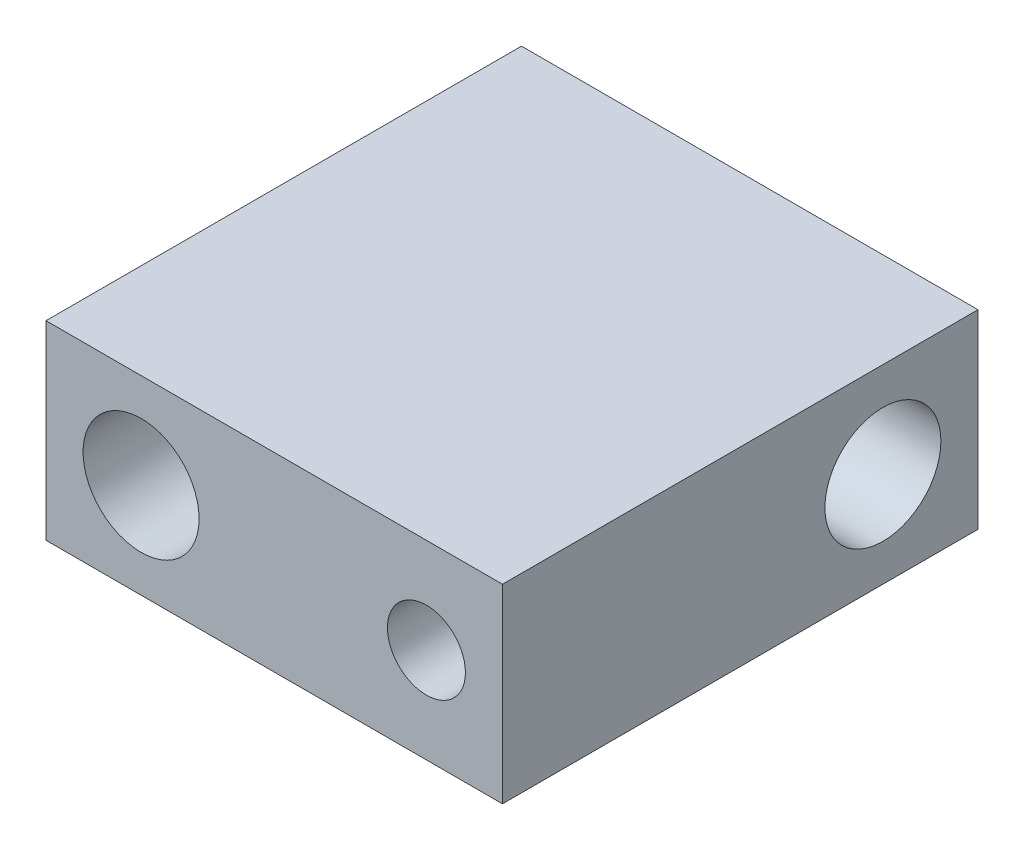
ISO-10303-21;
HEADER;
FILE_DESCRIPTION(('STEP AP214'),'2;1');
FILE_NAME('part.step','',(''),(''),'','','');
FILE_SCHEMA(('AUTOMOTIVE_DESIGN { 1 0 10303 214 1 1 1 1 }'));
ENDSEC;
DATA;
#1=APPLICATION_CONTEXT('core data for automotive mechanical design processes');
#2=APPLICATION_PROTOCOL_DEFINITION('international standard','automotive_design',2000,#1);
#3=PRODUCT_CONTEXT('',#1,'mechanical');
#4=PRODUCT('Part','Part','',(#3));
#5=PRODUCT_RELATED_PRODUCT_CATEGORY('part','',(#4));
#6=PRODUCT_DEFINITION_FORMATION('','',#4);
#7=PRODUCT_DEFINITION_CONTEXT('part definition',#1,'design');
#8=PRODUCT_DEFINITION('design','',#6,#7);
#9=PRODUCT_DEFINITION_SHAPE('','',#8);
#10=(LENGTH_UNIT() NAMED_UNIT(*) SI_UNIT(.MILLI.,.METRE.));
#11=(NAMED_UNIT(*) PLANE_ANGLE_UNIT() SI_UNIT($,.RADIAN.));
#12=(NAMED_UNIT(*) SI_UNIT($,.STERADIAN.) SOLID_ANGLE_UNIT());
#13=UNCERTAINTY_MEASURE_WITH_UNIT(LENGTH_MEASURE(1.E-05),#10,'distance_accuracy_value','');
#14=(GEOMETRIC_REPRESENTATION_CONTEXT(3) GLOBAL_UNCERTAINTY_ASSIGNED_CONTEXT((#13)) GLOBAL_UNIT_ASSIGNED_CONTEXT((#10,
#11,#12)) REPRESENTATION_CONTEXT('',''));
#15=CARTESIAN_POINT('',(0.,0.,0.));
#16=DIRECTION('',(0.,0.,1.));
#17=DIRECTION('',(1.,0.,0.));
#18=AXIS2_PLACEMENT_3D('',#15,#16,#17);
#19=CARTESIAN_POINT('',(0.,0.,30.));
#20=DIRECTION('',(0.,0.,1.));
#21=DIRECTION('',(1.,0.,0.));
#22=AXIS2_PLACEMENT_3D('',#19,#20,#21);
#23=PLANE('',#22);
#24=CARTESIAN_POINT('',(-14.,0.,30.));
#25=DIRECTION('',(0.,0.,1.));
#26=DIRECTION('',(1.,0.,0.));
#27=AXIS2_PLACEMENT_3D('',#24,#25,#26);
#28=CIRCLE('',#27,6.1);
#29=CARTESIAN_POINT('',(-7.9,0.,30.));
#30=VERTEX_POINT('',#29);
#31=EDGE_CURVE('E110',#30,#30,#28,.T.);
#32=ORIENTED_EDGE('',*,*,#31,.F.);
#33=EDGE_LOOP('',(#32));
#34=FACE_BOUND('',#33,.T.);
#35=DIRECTION('',(0.,1.,0.));
#36=VECTOR('',#35,1.);
#37=CARTESIAN_POINT('',(24.,10.,30.));
#38=LINE('',#37,#36);
#39=CARTESIAN_POINT('',(24.,-10.,30.));
#40=VERTEX_POINT('',#39);
#41=CARTESIAN_POINT('',(24.,10.,30.));
#42=VERTEX_POINT('',#41);
#43=EDGE_CURVE('E78',#40,#42,#38,.T.);
#44=ORIENTED_EDGE('',*,*,#43,.T.);
#45=DIRECTION('',(-1.,0.,0.));
#46=VECTOR('',#45,1.);
#47=CARTESIAN_POINT('',(-24.,10.,30.));
#48=LINE('',#47,#46);
#49=CARTESIAN_POINT('',(-24.,10.,30.));
#50=VERTEX_POINT('',#49);
#51=EDGE_CURVE('E116',#42,#50,#48,.T.);
#52=ORIENTED_EDGE('',*,*,#51,.T.);
#53=DIRECTION('',(0.,-1.,0.));
#54=VECTOR('',#53,1.);
#55=CARTESIAN_POINT('',(-24.,10.,30.));
#56=LINE('',#55,#54);
#57=CARTESIAN_POINT('',(-24.,-10.,30.));
#58=VERTEX_POINT('',#57);
#59=EDGE_CURVE('E53',#50,#58,#56,.T.);
#60=ORIENTED_EDGE('',*,*,#59,.T.);
#61=DIRECTION('',(1.,0.,0.));
#62=VECTOR('',#61,1.);
#63=CARTESIAN_POINT('',(-24.,-10.,30.));
#64=LINE('',#63,#62);
#65=EDGE_CURVE('E48',#58,#40,#64,.T.);
#66=ORIENTED_EDGE('',*,*,#65,.T.);
#67=EDGE_LOOP('',(#44,#52,#60,#66));
#68=FACE_BOUND('',#67,.T.);
#69=CARTESIAN_POINT('',(16.,0.,30.));
#70=DIRECTION('',(0.,0.,1.));
#71=DIRECTION('',(1.,0.,0.));
#72=AXIS2_PLACEMENT_3D('',#69,#70,#71);
#73=CIRCLE('',#72,4.1);
#74=CARTESIAN_POINT('',(20.1,0.,30.));
#75=VERTEX_POINT('',#74);
#76=EDGE_CURVE('E104',#75,#75,#73,.T.);
#77=ORIENTED_EDGE('',*,*,#76,.F.);
#78=EDGE_LOOP('',(#77));
#79=FACE_BOUND('',#78,.T.);
#80=ADVANCED_FACE('F33',(#34,#68,#79),#23,.T.);
#81=CARTESIAN_POINT('',(24.,10.,30.));
#82=DIRECTION('',(-1.,0.,0.));
#83=DIRECTION('',(0.,0.,1.));
#84=AXIS2_PLACEMENT_3D('',#81,#82,#83);
#85=PLANE('',#84);
#86=CARTESIAN_POINT('',(24.,0.,-10.));
#87=DIRECTION('',(1.,0.,0.));
#88=DIRECTION('',(0.,0.,-1.));
#89=AXIS2_PLACEMENT_3D('',#86,#87,#88);
#90=CIRCLE('',#89,6.1);
#91=CARTESIAN_POINT('',(24.,0.,-16.1));
#92=VERTEX_POINT('',#91);
#93=EDGE_CURVE('E97',#92,#92,#90,.T.);
#94=ORIENTED_EDGE('',*,*,#93,.F.);
#95=EDGE_LOOP('',(#94));
#96=FACE_BOUND('',#95,.T.);
#97=DIRECTION('',(0.,0.,-1.));
#98=VECTOR('',#97,1.);
#99=CARTESIAN_POINT('',(24.,-10.,30.));
#100=LINE('',#99,#98);
#101=CARTESIAN_POINT('',(24.,-10.,-20.));
#102=VERTEX_POINT('',#101);
#103=EDGE_CURVE('E73',#40,#102,#100,.T.);
#104=ORIENTED_EDGE('',*,*,#103,.T.);
#105=DIRECTION('',(0.,-1.,0.));
#106=VECTOR('',#105,1.);
#107=CARTESIAN_POINT('',(24.,10.,-20.));
#108=LINE('',#107,#106);
#109=CARTESIAN_POINT('',(24.,10.,-20.));
#110=VERTEX_POINT('',#109);
#111=EDGE_CURVE('E77',#110,#102,#108,.T.);
#112=ORIENTED_EDGE('',*,*,#111,.F.);
#113=DIRECTION('',(0.,0.,-1.));
#114=VECTOR('',#113,1.);
#115=CARTESIAN_POINT('',(24.,10.,30.));
#116=LINE('',#115,#114);
#117=EDGE_CURVE('E11',#42,#110,#116,.T.);
#118=ORIENTED_EDGE('',*,*,#117,.F.);
#119=ORIENTED_EDGE('',*,*,#43,.F.);
#120=EDGE_LOOP('',(#104,#112,#118,#119));
#121=FACE_BOUND('',#120,.T.);
#122=ADVANCED_FACE('F35',(#96,#121),#85,.F.);
#123=CARTESIAN_POINT('',(-24.,10.,30.));
#124=DIRECTION('',(0.,-1.,0.));
#125=DIRECTION('',(0.,0.,-1.));
#126=AXIS2_PLACEMENT_3D('',#123,#124,#125);
#127=PLANE('',#126);
#128=ORIENTED_EDGE('',*,*,#117,.T.);
#129=DIRECTION('',(1.,0.,0.));
#130=VECTOR('',#129,1.);
#131=CARTESIAN_POINT('',(24.,10.,-20.));
#132=LINE('',#131,#130);
#133=CARTESIAN_POINT('',(-24.,10.,-20.));
#134=VERTEX_POINT('',#133);
#135=EDGE_CURVE('E93',#134,#110,#132,.T.);
#136=ORIENTED_EDGE('',*,*,#135,.F.);
#137=DIRECTION('',(0.,0.,-1.));
#138=VECTOR('',#137,1.);
#139=CARTESIAN_POINT('',(-24.,10.,30.));
#140=LINE('',#139,#138);
#141=EDGE_CURVE('E41',#50,#134,#140,.T.);
#142=ORIENTED_EDGE('',*,*,#141,.F.);
#143=ORIENTED_EDGE('',*,*,#51,.F.);
#144=EDGE_LOOP('',(#128,#136,#142,#143));
#145=FACE_BOUND('',#144,.T.);
#146=ADVANCED_FACE('F124',(#145),#127,.F.);
#147=CARTESIAN_POINT('',(-24.,10.,30.));
#148=DIRECTION('',(1.,0.,0.));
#149=DIRECTION('',(0.,1.,0.));
#150=AXIS2_PLACEMENT_3D('',#147,#148,#149);
#151=PLANE('',#150);
#152=ORIENTED_EDGE('',*,*,#141,.T.);
#153=DIRECTION('',(0.,1.,0.));
#154=VECTOR('',#153,1.);
#155=CARTESIAN_POINT('',(-24.,10.,-20.));
#156=LINE('',#155,#154);
#157=CARTESIAN_POINT('',(-24.,-10.,-20.));
#158=VERTEX_POINT('',#157);
#159=EDGE_CURVE('E88',#158,#134,#156,.T.);
#160=ORIENTED_EDGE('',*,*,#159,.F.);
#161=DIRECTION('',(0.,0.,-1.));
#162=VECTOR('',#161,1.);
#163=CARTESIAN_POINT('',(-24.,-10.,30.));
#164=LINE('',#163,#162);
#165=EDGE_CURVE('E80',#58,#158,#164,.T.);
#166=ORIENTED_EDGE('',*,*,#165,.F.);
#167=ORIENTED_EDGE('',*,*,#59,.F.);
#168=EDGE_LOOP('',(#152,#160,#166,#167));
#169=FACE_BOUND('',#168,.T.);
#170=ADVANCED_FACE('F122',(#169),#151,.F.);
#171=CARTESIAN_POINT('',(-24.,-10.,30.));
#172=DIRECTION('',(0.,1.,0.));
#173=DIRECTION('',(0.,0.,1.));
#174=AXIS2_PLACEMENT_3D('',#171,#172,#173);
#175=PLANE('',#174);
#176=ORIENTED_EDGE('',*,*,#165,.T.);
#177=DIRECTION('',(-1.,0.,0.));
#178=VECTOR('',#177,1.);
#179=CARTESIAN_POINT('',(24.,-10.,-20.));
#180=LINE('',#179,#178);
#181=EDGE_CURVE('E83',#102,#158,#180,.T.);
#182=ORIENTED_EDGE('',*,*,#181,.F.);
#183=ORIENTED_EDGE('',*,*,#103,.F.);
#184=ORIENTED_EDGE('',*,*,#65,.F.);
#185=EDGE_LOOP('',(#176,#182,#183,#184));
#186=FACE_BOUND('',#185,.T.);
#187=ADVANCED_FACE('F84',(#186),#175,.F.);
#188=CARTESIAN_POINT('',(-14.,0.,30.));
#189=DIRECTION('',(0.,0.,-1.));
#190=DIRECTION('',(-1.,0.,0.));
#191=AXIS2_PLACEMENT_3D('',#188,#189,#190);
#192=CYLINDRICAL_SURFACE('',#191,6.1);
#193=ORIENTED_EDGE('',*,*,#31,.T.);
#194=EDGE_LOOP('',(#193));
#195=FACE_BOUND('',#194,.T.);
#196=CARTESIAN_POINT('',(-14.,0.,0.));
#197=DIRECTION('',(0.,0.,1.));
#198=DIRECTION('',(1.,0.,0.));
#199=AXIS2_PLACEMENT_3D('',#196,#197,#198);
#200=CIRCLE('',#199,6.1);
#201=CARTESIAN_POINT('',(-7.9,0.,0.));
#202=VERTEX_POINT('',#201);
#203=EDGE_CURVE('E107',#202,#202,#200,.T.);
#204=ORIENTED_EDGE('',*,*,#203,.F.);
#205=EDGE_LOOP('',(#204));
#206=FACE_BOUND('',#205,.T.);
#207=ADVANCED_FACE('F135',(#195,#206),#192,.F.);
#208=CARTESIAN_POINT('',(16.,0.,30.));
#209=DIRECTION('',(0.,0.,-1.));
#210=DIRECTION('',(-1.,0.,0.));
#211=AXIS2_PLACEMENT_3D('',#208,#209,#210);
#212=CYLINDRICAL_SURFACE('',#211,4.1);
#213=ORIENTED_EDGE('',*,*,#76,.T.);
#214=EDGE_LOOP('',(#213));
#215=FACE_BOUND('',#214,.T.);
#216=CARTESIAN_POINT('',(16.,0.,0.));
#217=DIRECTION('',(0.,0.,1.));
#218=DIRECTION('',(1.,0.,0.));
#219=AXIS2_PLACEMENT_3D('',#216,#217,#218);
#220=CIRCLE('',#219,4.1);
#221=CARTESIAN_POINT('',(20.1,0.,0.));
#222=VERTEX_POINT('',#221);
#223=EDGE_CURVE('E103',#222,#222,#220,.T.);
#224=ORIENTED_EDGE('',*,*,#223,.F.);
#225=EDGE_LOOP('',(#224));
#226=FACE_BOUND('',#225,.T.);
#227=ADVANCED_FACE('F131',(#215,#226),#212,.F.);
#228=CARTESIAN_POINT('',(0.,0.,0.));
#229=DIRECTION('',(0.,0.,-1.));
#230=DIRECTION('',(-1.,0.,0.));
#231=AXIS2_PLACEMENT_3D('',#228,#229,#230);
#232=PLANE('',#231);
#233=ORIENTED_EDGE('',*,*,#223,.T.);
#234=EDGE_LOOP('',(#233));
#235=FACE_BOUND('',#234,.T.);
#236=ADVANCED_FACE('F134',(#235),#232,.F.);
#237=ORIENTED_EDGE('',*,*,#203,.T.);
#238=EDGE_LOOP('',(#237));
#239=FACE_BOUND('',#238,.T.);
#240=ADVANCED_FACE('F140',(#239),#232,.F.);
#241=CARTESIAN_POINT('',(0.,0.,-20.));
#242=DIRECTION('',(0.,0.,-1.));
#243=DIRECTION('',(-1.,0.,0.));
#244=AXIS2_PLACEMENT_3D('',#241,#242,#243);
#245=PLANE('',#244);
#246=ORIENTED_EDGE('',*,*,#111,.T.);
#247=ORIENTED_EDGE('',*,*,#181,.T.);
#248=ORIENTED_EDGE('',*,*,#159,.T.);
#249=ORIENTED_EDGE('',*,*,#135,.T.);
#250=EDGE_LOOP('',(#246,#247,#248,#249));
#251=FACE_BOUND('',#250,.T.);
#252=ADVANCED_FACE('F91',(#251),#245,.T.);
#253=CARTESIAN_POINT('',(-16.,0.,-10.));
#254=DIRECTION('',(1.,0.,0.));
#255=DIRECTION('',(0.,0.,-1.));
#256=AXIS2_PLACEMENT_3D('',#253,#254,#255);
#257=CYLINDRICAL_SURFACE('',#256,6.1);
#258=CARTESIAN_POINT('',(-16.,0.,-10.));
#259=DIRECTION('',(1.,0.,0.));
#260=DIRECTION('',(0.,0.,-1.));
#261=AXIS2_PLACEMENT_3D('',#258,#259,#260);
#262=CIRCLE('',#261,6.1);
#263=CARTESIAN_POINT('',(-16.,0.,-16.1));
#264=VERTEX_POINT('',#263);
#265=EDGE_CURVE('E94',#264,#264,#262,.T.);
#266=ORIENTED_EDGE('',*,*,#265,.F.);
#267=EDGE_LOOP('',(#266));
#268=FACE_BOUND('',#267,.T.);
#269=ORIENTED_EDGE('',*,*,#93,.T.);
#270=EDGE_LOOP('',(#269));
#271=FACE_BOUND('',#270,.T.);
#272=ADVANCED_FACE('F165',(#268,#271),#257,.F.);
#273=CARTESIAN_POINT('',(-16.,0.,-10.));
#274=DIRECTION('',(1.,0.,0.));
#275=DIRECTION('',(0.,0.,-1.));
#276=AXIS2_PLACEMENT_3D('',#273,#274,#275);
#277=PLANE('',#276);
#278=ORIENTED_EDGE('',*,*,#265,.T.);
#279=EDGE_LOOP('',(#278));
#280=FACE_BOUND('',#279,.T.);
#281=ADVANCED_FACE('F167',(#280),#277,.T.);
#282=CLOSED_SHELL('',(#80,#122,#146,#170,#187,#207,#227,#236,#240,#252,#272,#281));
#283=MANIFOLD_SOLID_BREP('B2',#282);
#284=ADVANCED_BREP_SHAPE_REPRESENTATION('',(#18,#283),#14);
#285=SHAPE_DEFINITION_REPRESENTATION(#9,#284);
ENDSEC;
END-ISO-10303-21;
